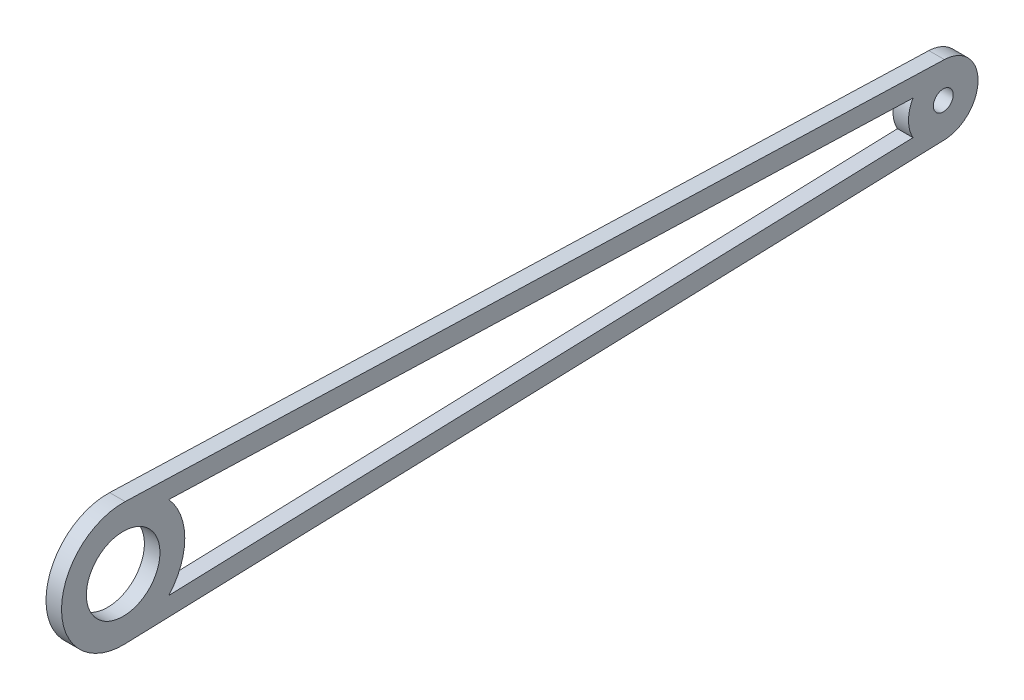
ISO-10303-21;
HEADER;
FILE_DESCRIPTION(('STEP AP214'),'2;1');
FILE_NAME('part.step','',(''),(''),'','','');
FILE_SCHEMA(('AUTOMOTIVE_DESIGN { 1 0 10303 214 1 1 1 1 }'));
ENDSEC;
DATA;
#1=APPLICATION_CONTEXT('core data for automotive mechanical design processes');
#2=APPLICATION_PROTOCOL_DEFINITION('international standard','automotive_design',2000,#1);
#3=PRODUCT_CONTEXT('',#1,'mechanical');
#4=PRODUCT('Part','Part','',(#3));
#5=PRODUCT_RELATED_PRODUCT_CATEGORY('part','',(#4));
#6=PRODUCT_DEFINITION_FORMATION('','',#4);
#7=PRODUCT_DEFINITION_CONTEXT('part definition',#1,'design');
#8=PRODUCT_DEFINITION('design','',#6,#7);
#9=PRODUCT_DEFINITION_SHAPE('','',#8);
#10=(LENGTH_UNIT() NAMED_UNIT(*) SI_UNIT(.MILLI.,.METRE.));
#11=(NAMED_UNIT(*) PLANE_ANGLE_UNIT() SI_UNIT($,.RADIAN.));
#12=(NAMED_UNIT(*) SI_UNIT($,.STERADIAN.) SOLID_ANGLE_UNIT());
#13=UNCERTAINTY_MEASURE_WITH_UNIT(LENGTH_MEASURE(1.E-05),#10,'distance_accuracy_value','');
#14=(GEOMETRIC_REPRESENTATION_CONTEXT(3) GLOBAL_UNCERTAINTY_ASSIGNED_CONTEXT((#13)) GLOBAL_UNIT_ASSIGNED_CONTEXT((#10,
#11,#12)) REPRESENTATION_CONTEXT('',''));
#15=CARTESIAN_POINT('',(0.,0.,0.));
#16=DIRECTION('',(0.,0.,1.));
#17=DIRECTION('',(1.,0.,0.));
#18=AXIS2_PLACEMENT_3D('',#15,#16,#17);
#19=CARTESIAN_POINT('',(1.5875,0.,0.));
#20=DIRECTION('',(-1.,0.,0.));
#21=DIRECTION('',(0.,0.,1.));
#22=AXIS2_PLACEMENT_3D('',#19,#20,#21);
#23=CYLINDRICAL_SURFACE('',#22,6.2992);
#24=CARTESIAN_POINT('',(0.,0.,0.));
#25=DIRECTION('',(1.,0.,0.));
#26=DIRECTION('',(0.,0.,-1.));
#27=AXIS2_PLACEMENT_3D('',#24,#25,#26);
#28=CIRCLE('',#27,6.2992);
#29=CARTESIAN_POINT('',(0.,-4.24413430473322,-4.65480876550118));
#30=VERTEX_POINT('',#29);
#31=CARTESIAN_POINT('',(0.,4.24413430473322,-4.65480876550119));
#32=VERTEX_POINT('',#31);
#33=EDGE_CURVE('E181',#30,#32,#28,.T.);
#34=ORIENTED_EDGE('',*,*,#33,.T.);
#35=DIRECTION('',(-1.,0.,0.));
#36=VECTOR('',#35,1.);
#37=CARTESIAN_POINT('',(1.5875,4.24413430473322,-4.65480876550119));
#38=LINE('',#37,#36);
#39=CARTESIAN_POINT('',(1.5875,4.24413430473322,-4.65480876550119));
#40=VERTEX_POINT('',#39);
#41=EDGE_CURVE('E11',#40,#32,#38,.T.);
#42=ORIENTED_EDGE('',*,*,#41,.F.);
#43=CARTESIAN_POINT('',(1.5875,0.,0.));
#44=DIRECTION('',(1.,0.,0.));
#45=DIRECTION('',(0.,0.,-1.));
#46=AXIS2_PLACEMENT_3D('',#43,#44,#45);
#47=CIRCLE('',#46,6.2992);
#48=CARTESIAN_POINT('',(1.5875,-4.24413430473322,-4.65480876550118));
#49=VERTEX_POINT('',#48);
#50=EDGE_CURVE('E116',#49,#40,#47,.T.);
#51=ORIENTED_EDGE('',*,*,#50,.F.);
#52=DIRECTION('',(-1.,0.,0.));
#53=VECTOR('',#52,1.);
#54=CARTESIAN_POINT('',(1.5875,-4.24413430473322,-4.65480876550118));
#55=LINE('',#54,#53);
#56=EDGE_CURVE('E54',#49,#30,#55,.T.);
#57=ORIENTED_EDGE('',*,*,#56,.T.);
#58=EDGE_LOOP('',(#34,#42,#51,#57));
#59=FACE_BOUND('',#58,.T.);
#60=ADVANCED_FACE('F35',(#59),#23,.T.);
#61=CARTESIAN_POINT('',(1.5875,0.499230256157115,-119.021135806206));
#62=DIRECTION('',(0.,0.999464319333029,-0.0327272727272728));
#63=DIRECTION('',(0.,0.0327272727272728,0.999464319333029));
#64=AXIS2_PLACEMENT_3D('',#61,#62,#63);
#65=PLANE('',#64);
#66=DIRECTION('',(0.,-0.0327272727272728,-0.999464319333029));
#67=VECTOR('',#66,1.);
#68=CARTESIAN_POINT('',(0.,0.499230256157115,-119.021135806206));
#69=LINE('',#68,#67);
#70=CARTESIAN_POINT('',(0.,1.75319005743999,-80.7262222732566));
#71=VERTEX_POINT('',#70);
#72=EDGE_CURVE('E122',#32,#71,#69,.T.);
#73=ORIENTED_EDGE('',*,*,#72,.T.);
#74=DIRECTION('',(-1.,0.,0.));
#75=VECTOR('',#74,1.);
#76=CARTESIAN_POINT('',(1.5875,1.75319005743999,-80.7262222732566));
#77=LINE('',#76,#75);
#78=CARTESIAN_POINT('',(1.5875,1.75319005743999,-80.7262222732566));
#79=VERTEX_POINT('',#78);
#80=EDGE_CURVE('E45',#79,#71,#77,.T.);
#81=ORIENTED_EDGE('',*,*,#80,.F.);
#82=DIRECTION('',(0.,-0.0327272727272728,-0.999464319333029));
#83=VECTOR('',#82,1.);
#84=CARTESIAN_POINT('',(1.5875,0.499230256157115,-119.021135806206));
#85=LINE('',#84,#83);
#86=EDGE_CURVE('E109',#40,#79,#85,.T.);
#87=ORIENTED_EDGE('',*,*,#86,.F.);
#88=ORIENTED_EDGE('',*,*,#41,.T.);
#89=EDGE_LOOP('',(#73,#81,#87,#88));
#90=FACE_BOUND('',#89,.T.);
#91=ADVANCED_FACE('F121',(#90),#65,.F.);
#92=CARTESIAN_POINT('',(1.5875,0.,-83.82));
#93=DIRECTION('',(-1.,0.,0.));
#94=DIRECTION('',(0.,0.,1.));
#95=AXIS2_PLACEMENT_3D('',#92,#93,#94);
#96=CYLINDRICAL_SURFACE('',#95,3.556);
#97=CARTESIAN_POINT('',(0.,0.,-83.82));
#98=DIRECTION('',(1.,0.,0.));
#99=DIRECTION('',(0.,0.,-1.));
#100=AXIS2_PLACEMENT_3D('',#97,#98,#99);
#101=CIRCLE('',#100,3.556);
#102=CARTESIAN_POINT('',(0.,-1.75319005743999,-80.7262222732566));
#103=VERTEX_POINT('',#102);
#104=EDGE_CURVE('E148',#71,#103,#101,.T.);
#105=ORIENTED_EDGE('',*,*,#104,.T.);
#106=DIRECTION('',(-1.,0.,0.));
#107=VECTOR('',#106,1.);
#108=CARTESIAN_POINT('',(1.5875,-1.75319005743999,-80.7262222732566));
#109=LINE('',#108,#107);
#110=CARTESIAN_POINT('',(1.5875,-1.75319005743999,-80.7262222732566));
#111=VERTEX_POINT('',#110);
#112=EDGE_CURVE('E81',#111,#103,#109,.T.);
#113=ORIENTED_EDGE('',*,*,#112,.F.);
#114=CARTESIAN_POINT('',(1.5875,0.,-83.82));
#115=DIRECTION('',(1.,0.,0.));
#116=DIRECTION('',(0.,0.,-1.));
#117=AXIS2_PLACEMENT_3D('',#114,#115,#116);
#118=CIRCLE('',#117,3.556);
#119=EDGE_CURVE('E115',#79,#111,#118,.T.);
#120=ORIENTED_EDGE('',*,*,#119,.F.);
#121=ORIENTED_EDGE('',*,*,#80,.T.);
#122=EDGE_LOOP('',(#105,#113,#120,#121));
#123=FACE_BOUND('',#122,.T.);
#124=ADVANCED_FACE('F126',(#123),#96,.T.);
#125=CARTESIAN_POINT('',(1.5875,-2.40178549583381,-119.126977879021));
#126=DIRECTION('',(0.,0.999464319333029,0.0327272727272727));
#127=DIRECTION('',(0.,-0.0327272727272727,0.999464319333029));
#128=AXIS2_PLACEMENT_3D('',#125,#126,#127);
#129=PLANE('',#128);
#130=DIRECTION('',(0.,0.0327272727272727,-0.999464319333029));
#131=VECTOR('',#130,1.);
#132=CARTESIAN_POINT('',(0.,-2.40178549583381,-119.126977879021));
#133=LINE('',#132,#131);
#134=CARTESIAN_POINT('',(0.,-6.29582564034262,-0.206155636363636));
#135=VERTEX_POINT('',#134);
#136=CARTESIAN_POINT('',(0.,-3.55409511954825,-83.9363781818182));
#137=VERTEX_POINT('',#136);
#138=EDGE_CURVE('E168',#135,#137,#133,.T.);
#139=ORIENTED_EDGE('',*,*,#138,.T.);
#140=DIRECTION('',(-1.,0.,0.));
#141=VECTOR('',#140,1.);
#142=CARTESIAN_POINT('',(1.5875,-3.55409511954825,-83.9363781818182));
#143=LINE('',#142,#141);
#144=CARTESIAN_POINT('',(1.5875,-3.55409511954825,-83.9363781818182));
#145=VERTEX_POINT('',#144);
#146=EDGE_CURVE('E39',#145,#137,#143,.T.);
#147=ORIENTED_EDGE('',*,*,#146,.F.);
#148=DIRECTION('',(0.,0.0327272727272727,-0.999464319333029));
#149=VECTOR('',#148,1.);
#150=CARTESIAN_POINT('',(1.5875,-2.40178549583381,-119.126977879021));
#151=LINE('',#150,#149);
#152=CARTESIAN_POINT('',(1.5875,-6.29582564034262,-0.206155636363636));
#153=VERTEX_POINT('',#152);
#154=EDGE_CURVE('E134',#153,#145,#151,.T.);
#155=ORIENTED_EDGE('',*,*,#154,.F.);
#156=DIRECTION('',(-1.,0.,0.));
#157=VECTOR('',#156,1.);
#158=CARTESIAN_POINT('',(1.5875,-6.29582564034262,-0.206155636363636));
#159=LINE('',#158,#157);
#160=EDGE_CURVE('E154',#153,#135,#159,.T.);
#161=ORIENTED_EDGE('',*,*,#160,.T.);
#162=EDGE_LOOP('',(#139,#147,#155,#161));
#163=FACE_BOUND('',#162,.T.);
#164=ADVANCED_FACE('F37',(#163),#129,.F.);
#165=CARTESIAN_POINT('',(0.,3.55409511954825,-83.9363781818182));
#166=VERTEX_POINT('',#165);
#167=EDGE_CURVE('E164',#137,#166,#101,.T.);
#168=ORIENTED_EDGE('',*,*,#167,.T.);
#169=DIRECTION('',(-1.,0.,0.));
#170=VECTOR('',#169,1.);
#171=CARTESIAN_POINT('',(1.5875,3.55409511954825,-83.9363781818182));
#172=LINE('',#171,#170);
#173=CARTESIAN_POINT('',(1.5875,3.55409511954825,-83.9363781818182));
#174=VERTEX_POINT('',#173);
#175=EDGE_CURVE('E158',#174,#166,#172,.T.);
#176=ORIENTED_EDGE('',*,*,#175,.F.);
#177=EDGE_CURVE('E94',#145,#174,#118,.T.);
#178=ORIENTED_EDGE('',*,*,#177,.F.);
#179=ORIENTED_EDGE('',*,*,#146,.T.);
#180=EDGE_LOOP('',(#168,#176,#178,#179));
#181=FACE_BOUND('',#180,.T.);
#182=ADVANCED_FACE('F163',(#181),#96,.T.);
#183=CARTESIAN_POINT('',(1.5875,2.40320978448654,-119.083481260752));
#184=DIRECTION('',(0.,0.999464319333029,-0.0327272727272727));
#185=DIRECTION('',(0.,0.0327272727272727,0.999464319333029));
#186=AXIS2_PLACEMENT_3D('',#183,#184,#185);
#187=PLANE('',#186);
#188=DIRECTION('',(0.,-0.0327272727272727,-0.999464319333029));
#189=VECTOR('',#188,1.);
#190=CARTESIAN_POINT('',(0.,2.40320978448654,-119.083481260752));
#191=LINE('',#190,#189);
#192=CARTESIAN_POINT('',(0.,6.29582564034262,-0.206155636363642));
#193=VERTEX_POINT('',#192);
#194=EDGE_CURVE('E173',#193,#166,#191,.T.);
#195=ORIENTED_EDGE('',*,*,#194,.F.);
#196=DIRECTION('',(-1.,0.,0.));
#197=VECTOR('',#196,1.);
#198=CARTESIAN_POINT('',(1.5875,6.29582564034262,-0.206155636363642));
#199=LINE('',#198,#197);
#200=CARTESIAN_POINT('',(1.5875,6.29582564034262,-0.206155636363642));
#201=VERTEX_POINT('',#200);
#202=EDGE_CURVE('E157',#201,#193,#199,.T.);
#203=ORIENTED_EDGE('',*,*,#202,.F.);
#204=DIRECTION('',(0.,-0.0327272727272727,-0.999464319333029));
#205=VECTOR('',#204,1.);
#206=CARTESIAN_POINT('',(1.5875,2.40320978448654,-119.083481260752));
#207=LINE('',#206,#205);
#208=EDGE_CURVE('E133',#201,#174,#207,.T.);
#209=ORIENTED_EDGE('',*,*,#208,.T.);
#210=ORIENTED_EDGE('',*,*,#175,.T.);
#211=EDGE_LOOP('',(#195,#203,#209,#210));
#212=FACE_BOUND('',#211,.T.);
#213=ADVANCED_FACE('F188',(#212),#187,.T.);
#214=CARTESIAN_POINT('',(1.5875,-0.497805967504394,-119.064632424476));
#215=DIRECTION('',(0.,0.999464319333029,0.0327272727272727));
#216=DIRECTION('',(0.,-0.0327272727272727,0.999464319333029));
#217=AXIS2_PLACEMENT_3D('',#214,#215,#216);
#218=PLANE('',#217);
#219=DIRECTION('',(0.,0.0327272727272727,-0.999464319333029));
#220=VECTOR('',#219,1.);
#221=CARTESIAN_POINT('',(0.,-0.497805967504394,-119.064632424476));
#222=LINE('',#221,#220);
#223=EDGE_CURVE('E143',#30,#103,#222,.T.);
#224=ORIENTED_EDGE('',*,*,#223,.F.);
#225=ORIENTED_EDGE('',*,*,#56,.F.);
#226=DIRECTION('',(0.,0.0327272727272727,-0.999464319333029));
#227=VECTOR('',#226,1.);
#228=CARTESIAN_POINT('',(1.5875,-0.497805967504394,-119.064632424476));
#229=LINE('',#228,#227);
#230=EDGE_CURVE('E127',#49,#111,#229,.T.);
#231=ORIENTED_EDGE('',*,*,#230,.T.);
#232=ORIENTED_EDGE('',*,*,#112,.T.);
#233=EDGE_LOOP('',(#224,#225,#231,#232));
#234=FACE_BOUND('',#233,.T.);
#235=ADVANCED_FACE('F185',(#234),#218,.T.);
#236=CARTESIAN_POINT('',(1.5875,0.,0.));
#237=DIRECTION('',(-1.,0.,0.));
#238=DIRECTION('',(0.,0.,1.));
#239=AXIS2_PLACEMENT_3D('',#236,#237,#238);
#240=CYLINDRICAL_SURFACE('',#239,3.7592);
#241=CARTESIAN_POINT('',(1.5875,0.,0.));
#242=DIRECTION('',(1.,0.,0.));
#243=DIRECTION('',(0.,0.,-1.));
#244=AXIS2_PLACEMENT_3D('',#241,#242,#243);
#245=CIRCLE('',#244,3.7592);
#246=CARTESIAN_POINT('',(1.5875,0.,-3.7592));
#247=VERTEX_POINT('',#246);
#248=EDGE_CURVE('E214',#247,#247,#245,.T.);
#249=ORIENTED_EDGE('',*,*,#248,.T.);
#250=EDGE_LOOP('',(#249));
#251=FACE_BOUND('',#250,.T.);
#252=CARTESIAN_POINT('',(0.,0.,0.));
#253=DIRECTION('',(1.,0.,0.));
#254=DIRECTION('',(0.,0.,-1.));
#255=AXIS2_PLACEMENT_3D('',#252,#253,#254);
#256=CIRCLE('',#255,3.7592);
#257=CARTESIAN_POINT('',(0.,0.,-3.7592));
#258=VERTEX_POINT('',#257);
#259=EDGE_CURVE('E180',#258,#258,#256,.T.);
#260=ORIENTED_EDGE('',*,*,#259,.F.);
#261=EDGE_LOOP('',(#260));
#262=FACE_BOUND('',#261,.T.);
#263=ADVANCED_FACE('F187',(#251,#262),#240,.F.);
#264=EDGE_CURVE('E178',#193,#135,#28,.T.);
#265=ORIENTED_EDGE('',*,*,#264,.T.);
#266=ORIENTED_EDGE('',*,*,#160,.F.);
#267=EDGE_CURVE('E138',#201,#153,#47,.T.);
#268=ORIENTED_EDGE('',*,*,#267,.F.);
#269=ORIENTED_EDGE('',*,*,#202,.T.);
#270=EDGE_LOOP('',(#265,#266,#268,#269));
#271=FACE_BOUND('',#270,.T.);
#272=ADVANCED_FACE('F194',(#271),#23,.T.);
#273=CARTESIAN_POINT('',(1.5875,0.,-83.82));
#274=DIRECTION('',(-1.,0.,0.));
#275=DIRECTION('',(0.,0.,1.));
#276=AXIS2_PLACEMENT_3D('',#273,#274,#275);
#277=CYLINDRICAL_SURFACE('',#276,1.016);
#278=CARTESIAN_POINT('',(1.5875,0.,-83.82));
#279=DIRECTION('',(1.,0.,0.));
#280=DIRECTION('',(0.,0.,-1.));
#281=AXIS2_PLACEMENT_3D('',#278,#279,#280);
#282=CIRCLE('',#281,1.016);
#283=CARTESIAN_POINT('',(1.5875,0.,-84.836));
#284=VERTEX_POINT('',#283);
#285=EDGE_CURVE('E129',#284,#284,#282,.T.);
#286=ORIENTED_EDGE('',*,*,#285,.T.);
#287=EDGE_LOOP('',(#286));
#288=FACE_BOUND('',#287,.T.);
#289=CARTESIAN_POINT('',(0.,0.,-83.82));
#290=DIRECTION('',(1.,0.,0.));
#291=DIRECTION('',(0.,0.,-1.));
#292=AXIS2_PLACEMENT_3D('',#289,#290,#291);
#293=CIRCLE('',#292,1.016);
#294=CARTESIAN_POINT('',(0.,0.,-84.836));
#295=VERTEX_POINT('',#294);
#296=EDGE_CURVE('E139',#295,#295,#293,.T.);
#297=ORIENTED_EDGE('',*,*,#296,.F.);
#298=EDGE_LOOP('',(#297));
#299=FACE_BOUND('',#298,.T.);
#300=ADVANCED_FACE('F206',(#288,#299),#277,.F.);
#301=CARTESIAN_POINT('',(1.5875,0.664887835568575,-119.026560232747));
#302=DIRECTION('',(1.,0.,0.));
#303=DIRECTION('',(0.,0.,-1.));
#304=AXIS2_PLACEMENT_3D('',#301,#302,#303);
#305=PLANE('',#304);
#306=ORIENTED_EDGE('',*,*,#154,.T.);
#307=ORIENTED_EDGE('',*,*,#177,.T.);
#308=ORIENTED_EDGE('',*,*,#208,.F.);
#309=ORIENTED_EDGE('',*,*,#267,.T.);
#310=EDGE_LOOP('',(#306,#307,#308,#309));
#311=FACE_BOUND('',#310,.T.);
#312=ORIENTED_EDGE('',*,*,#248,.F.);
#313=EDGE_LOOP('',(#312));
#314=FACE_BOUND('',#313,.T.);
#315=ORIENTED_EDGE('',*,*,#50,.T.);
#316=ORIENTED_EDGE('',*,*,#86,.T.);
#317=ORIENTED_EDGE('',*,*,#119,.T.);
#318=ORIENTED_EDGE('',*,*,#230,.F.);
#319=EDGE_LOOP('',(#315,#316,#317,#318));
#320=FACE_BOUND('',#319,.T.);
#321=ORIENTED_EDGE('',*,*,#285,.F.);
#322=EDGE_LOOP('',(#321));
#323=FACE_BOUND('',#322,.T.);
#324=ADVANCED_FACE('F111',(#311,#314,#320,#323),#305,.T.);
#325=CARTESIAN_POINT('',(0.,0.664887835568575,-119.026560232747));
#326=DIRECTION('',(1.,0.,0.));
#327=DIRECTION('',(0.,0.,-1.));
#328=AXIS2_PLACEMENT_3D('',#325,#326,#327);
#329=PLANE('',#328);
#330=ORIENTED_EDGE('',*,*,#138,.F.);
#331=ORIENTED_EDGE('',*,*,#264,.F.);
#332=ORIENTED_EDGE('',*,*,#194,.T.);
#333=ORIENTED_EDGE('',*,*,#167,.F.);
#334=EDGE_LOOP('',(#330,#331,#332,#333));
#335=FACE_BOUND('',#334,.T.);
#336=ORIENTED_EDGE('',*,*,#259,.T.);
#337=EDGE_LOOP('',(#336));
#338=FACE_BOUND('',#337,.T.);
#339=ORIENTED_EDGE('',*,*,#33,.F.);
#340=ORIENTED_EDGE('',*,*,#223,.T.);
#341=ORIENTED_EDGE('',*,*,#104,.F.);
#342=ORIENTED_EDGE('',*,*,#72,.F.);
#343=EDGE_LOOP('',(#339,#340,#341,#342));
#344=FACE_BOUND('',#343,.T.);
#345=ORIENTED_EDGE('',*,*,#296,.T.);
#346=EDGE_LOOP('',(#345));
#347=FACE_BOUND('',#346,.T.);
#348=ADVANCED_FACE('F184',(#335,#338,#344,#347),#329,.F.);
#349=CLOSED_SHELL('',(#60,#91,#124,#164,#182,#213,#235,#263,#272,#300,#324,#348));
#350=MANIFOLD_SOLID_BREP('B2',#349);
#351=ADVANCED_BREP_SHAPE_REPRESENTATION('',(#18,#350),#14);
#352=SHAPE_DEFINITION_REPRESENTATION(#9,#351);
ENDSEC;
END-ISO-10303-21;
